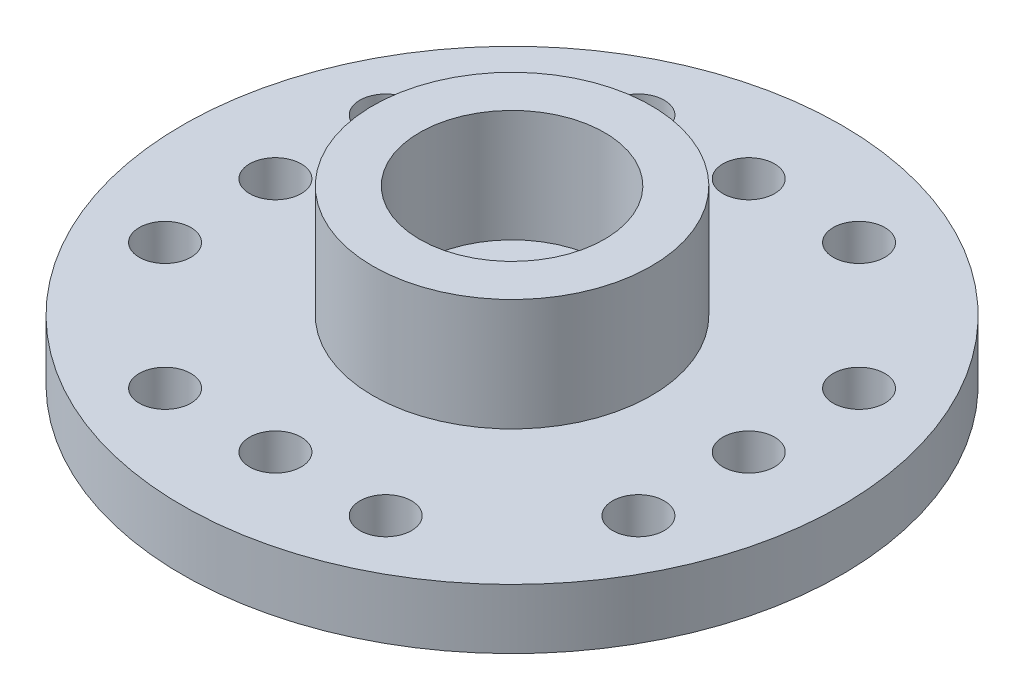
ISO-10303-21;
HEADER;
FILE_DESCRIPTION(('STEP AP214'),'2;1');
FILE_NAME('part.step','',(''),(''),'','','');
FILE_SCHEMA(('AUTOMOTIVE_DESIGN { 1 0 10303 214 1 1 1 1 }'));
ENDSEC;
DATA;
#1=APPLICATION_CONTEXT('core data for automotive mechanical design processes');
#2=APPLICATION_PROTOCOL_DEFINITION('international standard','automotive_design',2000,#1);
#3=PRODUCT_CONTEXT('',#1,'mechanical');
#4=PRODUCT('Part','Part','',(#3));
#5=PRODUCT_RELATED_PRODUCT_CATEGORY('part','',(#4));
#6=PRODUCT_DEFINITION_FORMATION('','',#4);
#7=PRODUCT_DEFINITION_CONTEXT('part definition',#1,'design');
#8=PRODUCT_DEFINITION('design','',#6,#7);
#9=PRODUCT_DEFINITION_SHAPE('','',#8);
#10=(LENGTH_UNIT() NAMED_UNIT(*) SI_UNIT(.MILLI.,.METRE.));
#11=(NAMED_UNIT(*) PLANE_ANGLE_UNIT() SI_UNIT($,.RADIAN.));
#12=(NAMED_UNIT(*) SI_UNIT($,.STERADIAN.) SOLID_ANGLE_UNIT());
#13=UNCERTAINTY_MEASURE_WITH_UNIT(LENGTH_MEASURE(1.E-05),#10,'distance_accuracy_value','');
#14=(GEOMETRIC_REPRESENTATION_CONTEXT(3) GLOBAL_UNCERTAINTY_ASSIGNED_CONTEXT((#13)) GLOBAL_UNIT_ASSIGNED_CONTEXT((#10,
#11,#12)) REPRESENTATION_CONTEXT('',''));
#15=CARTESIAN_POINT('',(0.,0.,0.));
#16=DIRECTION('',(0.,0.,1.));
#17=DIRECTION('',(1.,0.,0.));
#18=AXIS2_PLACEMENT_3D('',#15,#16,#17);
#19=CARTESIAN_POINT('',(0.,5.456,0.));
#20=DIRECTION('',(0.,-1.,0.));
#21=DIRECTION('',(0.,0.,-1.));
#22=AXIS2_PLACEMENT_3D('',#19,#20,#21);
#23=CYLINDRICAL_SURFACE('',#22,1.49225);
#24=CARTESIAN_POINT('',(0.,0.,0.));
#25=DIRECTION('',(0.,-1.,0.));
#26=DIRECTION('',(0.,0.,-1.));
#27=AXIS2_PLACEMENT_3D('',#24,#25,#26);
#28=CIRCLE('',#27,1.49225);
#29=CARTESIAN_POINT('',(0.,0.,-1.49225));
#30=VERTEX_POINT('',#29);
#31=EDGE_CURVE('E93',#30,#30,#28,.T.);
#32=ORIENTED_EDGE('',*,*,#31,.T.);
#33=EDGE_LOOP('',(#32));
#34=FACE_BOUND('',#33,.T.);
#35=CARTESIAN_POINT('',(0.,1.9,0.));
#36=DIRECTION('',(0.,1.,0.));
#37=DIRECTION('',(0.,0.,1.));
#38=AXIS2_PLACEMENT_3D('',#35,#36,#37);
#39=CIRCLE('',#38,1.49225);
#40=CARTESIAN_POINT('',(0.,1.9,1.49225));
#41=VERTEX_POINT('',#40);
#42=EDGE_CURVE('E35',#41,#41,#39,.F.);
#43=ORIENTED_EDGE('',*,*,#42,.F.);
#44=EDGE_LOOP('',(#43));
#45=FACE_BOUND('',#44,.T.);
#46=ADVANCED_FACE('F31',(#34,#45),#23,.F.);
#47=CARTESIAN_POINT('',(0.,1.9,0.));
#48=DIRECTION('',(0.,-1.,0.));
#49=DIRECTION('',(0.,0.,-1.));
#50=AXIS2_PLACEMENT_3D('',#47,#48,#49);
#51=CYLINDRICAL_SURFACE('',#50,10.4521);
#52=CARTESIAN_POINT('',(0.,1.9,0.));
#53=DIRECTION('',(0.,1.,0.));
#54=DIRECTION('',(0.,0.,1.));
#55=AXIS2_PLACEMENT_3D('',#52,#53,#54);
#56=CIRCLE('',#55,10.4521);
#57=CARTESIAN_POINT('',(0.,1.9,-10.4521));
#58=VERTEX_POINT('',#57);
#59=EDGE_CURVE('E39',#58,#58,#56,.T.);
#60=CARTESIAN_POINT('',(0.,0.,0.));
#61=DIRECTION('',(0.,1.,0.));
#62=DIRECTION('',(0.,0.,1.));
#63=AXIS2_PLACEMENT_3D('',#60,#61,#62);
#64=CIRCLE('',#63,10.4521);
#65=CARTESIAN_POINT('',(0.,0.,-10.4521));
#66=VERTEX_POINT('',#65);
#67=EDGE_CURVE('E44',#66,#66,#64,.T.);
#68=CARTESIAN_POINT('',(0.,1.9,-10.4521));
#69=CARTESIAN_POINT('',(0.,1.88020833333333,-10.4521));
#70=CARTESIAN_POINT('',(0.,1.86041666666667,-10.4521));
#71=CARTESIAN_POINT('',(0.,1.82083333333333,-10.4521));
#72=CARTESIAN_POINT('',(0.,1.80104166666667,-10.4521));
#73=CARTESIAN_POINT('',(0.,1.76145833333333,-10.4521));
#74=CARTESIAN_POINT('',(0.,1.74166666666667,-10.4521));
#75=CARTESIAN_POINT('',(0.,1.70208333333333,-10.4521));
#76=CARTESIAN_POINT('',(0.,1.68229166666667,-10.4521));
#77=CARTESIAN_POINT('',(0.,1.64270833333333,-10.4521));
#78=CARTESIAN_POINT('',(0.,1.62291666666667,-10.4521));
#79=CARTESIAN_POINT('',(0.,1.58333333333333,-10.4521));
#80=CARTESIAN_POINT('',(0.,1.56354166666667,-10.4521));
#81=CARTESIAN_POINT('',(0.,1.52395833333333,-10.4521));
#82=CARTESIAN_POINT('',(0.,1.50416666666667,-10.4521));
#83=CARTESIAN_POINT('',(0.,1.46458333333333,-10.4521));
#84=CARTESIAN_POINT('',(0.,1.44479166666667,-10.4521));
#85=CARTESIAN_POINT('',(0.,1.40520833333333,-10.4521));
#86=CARTESIAN_POINT('',(0.,1.38541666666667,-10.4521));
#87=CARTESIAN_POINT('',(0.,1.34583333333333,-10.4521));
#88=CARTESIAN_POINT('',(0.,1.32604166666667,-10.4521));
#89=CARTESIAN_POINT('',(0.,1.28645833333333,-10.4521));
#90=CARTESIAN_POINT('',(0.,1.26666666666667,-10.4521));
#91=CARTESIAN_POINT('',(0.,1.22708333333333,-10.4521));
#92=CARTESIAN_POINT('',(0.,1.20729166666667,-10.4521));
#93=CARTESIAN_POINT('',(0.,1.16770833333333,-10.4521));
#94=CARTESIAN_POINT('',(0.,1.14791666666667,-10.4521));
#95=CARTESIAN_POINT('',(0.,1.10833333333333,-10.4521));
#96=CARTESIAN_POINT('',(0.,1.08854166666667,-10.4521));
#97=CARTESIAN_POINT('',(0.,1.04895833333333,-10.4521));
#98=CARTESIAN_POINT('',(0.,1.02916666666667,-10.4521));
#99=CARTESIAN_POINT('',(0.,0.989583333333333,-10.4521));
#100=CARTESIAN_POINT('',(0.,0.969791666666666,-10.4521));
#101=CARTESIAN_POINT('',(0.,0.930208333333333,-10.4521));
#102=CARTESIAN_POINT('',(0.,0.910416666666667,-10.4521));
#103=CARTESIAN_POINT('',(0.,0.870833333333333,-10.4521));
#104=CARTESIAN_POINT('',(0.,0.851041666666667,-10.4521));
#105=CARTESIAN_POINT('',(0.,0.811458333333333,-10.4521));
#106=CARTESIAN_POINT('',(0.,0.791666666666667,-10.4521));
#107=CARTESIAN_POINT('',(0.,0.752083333333333,-10.4521));
#108=CARTESIAN_POINT('',(0.,0.732291666666667,-10.4521));
#109=CARTESIAN_POINT('',(0.,0.692708333333333,-10.4521));
#110=CARTESIAN_POINT('',(0.,0.672916666666667,-10.4521));
#111=CARTESIAN_POINT('',(0.,0.633333333333333,-10.4521));
#112=CARTESIAN_POINT('',(0.,0.613541666666667,-10.4521));
#113=CARTESIAN_POINT('',(0.,0.573958333333333,-10.4521));
#114=CARTESIAN_POINT('',(0.,0.554166666666667,-10.4521));
#115=CARTESIAN_POINT('',(0.,0.514583333333334,-10.4521));
#116=CARTESIAN_POINT('',(0.,0.494791666666667,-10.4521));
#117=CARTESIAN_POINT('',(0.,0.455208333333333,-10.4521));
#118=CARTESIAN_POINT('',(0.,0.435416666666667,-10.4521));
#119=CARTESIAN_POINT('',(0.,0.395833333333333,-10.4521));
#120=CARTESIAN_POINT('',(0.,0.376041666666667,-10.4521));
#121=CARTESIAN_POINT('',(0.,0.336458333333333,-10.4521));
#122=CARTESIAN_POINT('',(0.,0.316666666666667,-10.4521));
#123=CARTESIAN_POINT('',(0.,0.277083333333333,-10.4521));
#124=CARTESIAN_POINT('',(0.,0.257291666666667,-10.4521));
#125=CARTESIAN_POINT('',(0.,0.217708333333333,-10.4521));
#126=CARTESIAN_POINT('',(0.,0.197916666666667,-10.4521));
#127=CARTESIAN_POINT('',(0.,0.158333333333333,-10.4521));
#128=CARTESIAN_POINT('',(0.,0.138541666666667,-10.4521));
#129=CARTESIAN_POINT('',(0.,0.0989583333333333,-10.4521));
#130=CARTESIAN_POINT('',(0.,0.0791666666666666,-10.4521));
#131=CARTESIAN_POINT('',(0.,0.0395833333333333,-10.4521));
#132=CARTESIAN_POINT('',(0.,0.0197916666666666,-10.4521));
#133=CARTESIAN_POINT('',(0.,0.,-10.4521));
#134=B_SPLINE_CURVE_WITH_KNOTS('',3,(#68,#69,#70,#71,#72,#73,#74,#75,#76,#77,#78,#79,#80,#81,
#82,#83,#84,#85,#86,#87,#88,#89,#90,#91,#92,#93,#94,#95,#96,#97,#98,#99,#100,#101,#102,#103,
#104,#105,#106,#107,#108,#109,#110,#111,#112,#113,#114,#115,#116,#117,#118,#119,#120,#121,#122,
#123,#124,#125,#126,#127,#128,#129,#130,#131,#132,#133),.UNSPECIFIED.,.F.,.F.,(4,2,2,2,2,2,2,2,
2,2,2,2,2,2,2,2,2,2,2,2,2,2,2,2,2,2,2,2,2,2,2,2,4),(0.,0.0593750000000002,0.11875,0.178125,
0.2375,0.296875,0.35625,0.415625,0.475,0.534375,0.59375,0.653125,0.7125,0.771875,0.83125,
0.890625,0.95,1.009375,1.06875,1.128125,1.1875,1.246875,1.30625,1.365625,1.425,1.484375,1.54375,
1.603125,1.6625,1.721875,1.78125,1.840625,1.9),.UNSPECIFIED.);
#135=EDGE_CURVE('BSEAM33',#58,#66,#134,.T.);
#136=ORIENTED_EDGE('',*,*,#59,.F.);
#137=ORIENTED_EDGE('',*,*,#67,.T.);
#138=ORIENTED_EDGE('',*,*,#135,.T.);
#139=ORIENTED_EDGE('',*,*,#135,.F.);
#140=EDGE_LOOP('',(#136,#138,#137,#139));
#141=FACE_BOUND('',#140,.T.);
#142=ADVANCED_FACE('F33',(#141),#51,.T.);
#143=CARTESIAN_POINT('',(0.,1.9,0.));
#144=DIRECTION('',(0.,1.,0.));
#145=DIRECTION('',(0.,0.,1.));
#146=AXIS2_PLACEMENT_3D('',#143,#144,#145);
#147=PLANE('',#146);
#148=CARTESIAN_POINT('',(7.50569999999998,1.9,-3.49885000000005));
#149=DIRECTION('',(0.,1.,0.));
#150=DIRECTION('',(0.,0.,1.));
#151=AXIS2_PLACEMENT_3D('',#148,#149,#150);
#152=CIRCLE('',#151,0.819150000000002);
#153=CARTESIAN_POINT('',(7.50569999999998,1.9,-2.67970000000005));
#154=VERTEX_POINT('',#153);
#155=EDGE_CURVE('E53',#154,#154,#152,.T.);
#156=ORIENTED_EDGE('',*,*,#155,.F.);
#157=EDGE_LOOP('',(#156));
#158=FACE_BOUND('',#157,.T.);
#159=CARTESIAN_POINT('',(7.5057,1.9,0.));
#160=DIRECTION('',(0.,1.,0.));
#161=DIRECTION('',(0.,0.,1.));
#162=AXIS2_PLACEMENT_3D('',#159,#160,#161);
#163=CIRCLE('',#162,0.819150000000001);
#164=CARTESIAN_POINT('',(7.5057,1.9,0.819149999999949));
#165=VERTEX_POINT('',#164);
#166=EDGE_CURVE('E57',#165,#165,#163,.T.);
#167=ORIENTED_EDGE('',*,*,#166,.F.);
#168=EDGE_LOOP('',(#167));
#169=FACE_BOUND('',#168,.T.);
#170=CARTESIAN_POINT('',(-3.49884999999997,1.9,7.50570000000001));
#171=DIRECTION('',(0.,1.,0.));
#172=DIRECTION('',(0.,0.,1.));
#173=AXIS2_PLACEMENT_3D('',#170,#171,#172);
#174=CIRCLE('',#173,0.819150000000001);
#175=CARTESIAN_POINT('',(-3.49884999999997,1.9,8.32485000000001));
#176=VERTEX_POINT('',#175);
#177=EDGE_CURVE('E61',#176,#176,#174,.T.);
#178=ORIENTED_EDGE('',*,*,#177,.F.);
#179=EDGE_LOOP('',(#178));
#180=FACE_BOUND('',#179,.T.);
#181=CARTESIAN_POINT('',(3.49885000000002,1.9,7.50569999999999));
#182=DIRECTION('',(0.,1.,0.));
#183=DIRECTION('',(0.,0.,1.));
#184=AXIS2_PLACEMENT_3D('',#181,#182,#183);
#185=CIRCLE('',#184,0.819150000000002);
#186=CARTESIAN_POINT('',(3.49885000000002,1.9,8.32484999999999));
#187=VERTEX_POINT('',#186);
#188=EDGE_CURVE('E66',#187,#187,#185,.T.);
#189=ORIENTED_EDGE('',*,*,#188,.F.);
#190=EDGE_LOOP('',(#189));
#191=FACE_BOUND('',#190,.T.);
#192=CARTESIAN_POINT('',(-7.5057,1.9,0.));
#193=DIRECTION('',(0.,1.,0.));
#194=DIRECTION('',(0.,0.,1.));
#195=AXIS2_PLACEMENT_3D('',#192,#193,#194);
#196=CIRCLE('',#195,0.819150000000001);
#197=CARTESIAN_POINT('',(-7.5057,1.9,0.81915));
#198=VERTEX_POINT('',#197);
#199=EDGE_CURVE('E69',#198,#198,#196,.T.);
#200=ORIENTED_EDGE('',*,*,#199,.F.);
#201=EDGE_LOOP('',(#200));
#202=FACE_BOUND('',#201,.T.);
#203=CARTESIAN_POINT('',(-7.5057,1.9,3.49885));
#204=DIRECTION('',(0.,1.,0.));
#205=DIRECTION('',(0.,0.,1.));
#206=AXIS2_PLACEMENT_3D('',#203,#204,#205);
#207=CIRCLE('',#206,0.819150000000002);
#208=CARTESIAN_POINT('',(-7.5057,1.9,4.318));
#209=VERTEX_POINT('',#208);
#210=EDGE_CURVE('E72',#209,#209,#207,.T.);
#211=ORIENTED_EDGE('',*,*,#210,.F.);
#212=EDGE_LOOP('',(#211));
#213=FACE_BOUND('',#212,.T.);
#214=CARTESIAN_POINT('',(-7.5057,1.9,-3.49885));
#215=DIRECTION('',(0.,1.,0.));
#216=DIRECTION('',(0.,0.,1.));
#217=AXIS2_PLACEMENT_3D('',#214,#215,#216);
#218=CIRCLE('',#217,0.819150000000001);
#219=CARTESIAN_POINT('',(-7.5057,1.9,-2.6797));
#220=VERTEX_POINT('',#219);
#221=EDGE_CURVE('E75',#220,#220,#218,.T.);
#222=ORIENTED_EDGE('',*,*,#221,.F.);
#223=EDGE_LOOP('',(#222));
#224=FACE_BOUND('',#223,.T.);
#225=CARTESIAN_POINT('',(0.,1.9,7.5057));
#226=DIRECTION('',(0.,1.,0.));
#227=DIRECTION('',(0.,0.,1.));
#228=AXIS2_PLACEMENT_3D('',#225,#226,#227);
#229=CIRCLE('',#228,0.819150000000001);
#230=CARTESIAN_POINT('',(0.,1.9,8.32485));
#231=VERTEX_POINT('',#230);
#232=EDGE_CURVE('E78',#231,#231,#229,.T.);
#233=ORIENTED_EDGE('',*,*,#232,.F.);
#234=EDGE_LOOP('',(#233));
#235=FACE_BOUND('',#234,.T.);
#236=CARTESIAN_POINT('',(3.49884999999992,1.9,-7.50570000000004));
#237=DIRECTION('',(0.,1.,0.));
#238=DIRECTION('',(0.,0.,1.));
#239=AXIS2_PLACEMENT_3D('',#236,#237,#238);
#240=CIRCLE('',#239,0.819150000000001);
#241=CARTESIAN_POINT('',(3.49884999999992,1.9,-6.68655000000004));
#242=VERTEX_POINT('',#241);
#243=EDGE_CURVE('E81',#242,#242,#240,.T.);
#244=ORIENTED_EDGE('',*,*,#243,.F.);
#245=EDGE_LOOP('',(#244));
#246=FACE_BOUND('',#245,.T.);
#247=CARTESIAN_POINT('',(-3.49885000000008,1.9,-7.50569999999996));
#248=DIRECTION('',(0.,1.,0.));
#249=DIRECTION('',(0.,0.,1.));
#250=AXIS2_PLACEMENT_3D('',#247,#248,#249);
#251=CIRCLE('',#250,0.819150000000002);
#252=CARTESIAN_POINT('',(-3.49885000000008,1.9,-6.68654999999996));
#253=VERTEX_POINT('',#252);
#254=EDGE_CURVE('E84',#253,#253,#251,.T.);
#255=ORIENTED_EDGE('',*,*,#254,.F.);
#256=EDGE_LOOP('',(#255));
#257=FACE_BOUND('',#256,.T.);
#258=CARTESIAN_POINT('',(0.,1.9,-7.5057));
#259=DIRECTION('',(0.,1.,0.));
#260=DIRECTION('',(0.,0.,1.));
#261=AXIS2_PLACEMENT_3D('',#258,#259,#260);
#262=CIRCLE('',#261,0.819150000000001);
#263=CARTESIAN_POINT('',(0.,1.9,-6.68655));
#264=VERTEX_POINT('',#263);
#265=EDGE_CURVE('E87',#264,#264,#262,.T.);
#266=ORIENTED_EDGE('',*,*,#265,.F.);
#267=EDGE_LOOP('',(#266));
#268=FACE_BOUND('',#267,.T.);
#269=CARTESIAN_POINT('',(7.50570000000002,1.9,3.49884999999995));
#270=DIRECTION('',(0.,1.,0.));
#271=DIRECTION('',(0.,0.,1.));
#272=AXIS2_PLACEMENT_3D('',#269,#270,#271);
#273=CIRCLE('',#272,0.819150000000001);
#274=CARTESIAN_POINT('',(7.50570000000002,1.9,4.31799999999995));
#275=VERTEX_POINT('',#274);
#276=EDGE_CURVE('E90',#275,#275,#273,.T.);
#277=ORIENTED_EDGE('',*,*,#276,.F.);
#278=EDGE_LOOP('',(#277));
#279=FACE_BOUND('',#278,.T.);
#280=CARTESIAN_POINT('',(0.,1.9,0.));
#281=DIRECTION('',(0.,1.,0.));
#282=DIRECTION('',(0.,0.,1.));
#283=AXIS2_PLACEMENT_3D('',#280,#281,#282);
#284=CIRCLE('',#283,4.41325);
#285=CARTESIAN_POINT('',(0.,1.9,4.41325));
#286=VERTEX_POINT('',#285);
#287=EDGE_CURVE('E10',#286,#286,#284,.T.);
#288=ORIENTED_EDGE('',*,*,#287,.F.);
#289=EDGE_LOOP('',(#288));
#290=FACE_BOUND('',#289,.T.);
#291=ORIENTED_EDGE('',*,*,#59,.T.);
#292=EDGE_LOOP('',(#291));
#293=FACE_BOUND('',#292,.T.);
#294=ADVANCED_FACE('F162',(#158,#169,#180,#191,#202,#213,#224,#235,#246,#257,#268,#279,#290,
#293),#147,.T.);
#295=CARTESIAN_POINT('',(0.,0.,0.));
#296=DIRECTION('',(0.,1.,0.));
#297=DIRECTION('',(0.,0.,1.));
#298=AXIS2_PLACEMENT_3D('',#295,#296,#297);
#299=PLANE('',#298);
#300=CARTESIAN_POINT('',(7.50569999999998,0.,-3.49885000000005));
#301=DIRECTION('',(0.,-1.,0.));
#302=DIRECTION('',(0.,0.,-1.));
#303=AXIS2_PLACEMENT_3D('',#300,#301,#302);
#304=CIRCLE('',#303,0.819150000000002);
#305=CARTESIAN_POINT('',(7.50569999999998,0.,-4.31800000000005));
#306=VERTEX_POINT('',#305);
#307=EDGE_CURVE('E109',#306,#306,#304,.T.);
#308=ORIENTED_EDGE('',*,*,#307,.F.);
#309=EDGE_LOOP('',(#308));
#310=FACE_BOUND('',#309,.T.);
#311=CARTESIAN_POINT('',(7.5057,0.,0.));
#312=DIRECTION('',(0.,-1.,0.));
#313=DIRECTION('',(0.,0.,-1.));
#314=AXIS2_PLACEMENT_3D('',#311,#312,#313);
#315=CIRCLE('',#314,0.819150000000001);
#316=CARTESIAN_POINT('',(7.5057,0.,-0.819150000000052));
#317=VERTEX_POINT('',#316);
#318=EDGE_CURVE('E112',#317,#317,#315,.T.);
#319=ORIENTED_EDGE('',*,*,#318,.F.);
#320=EDGE_LOOP('',(#319));
#321=FACE_BOUND('',#320,.T.);
#322=CARTESIAN_POINT('',(-3.49884999999997,0.,7.50570000000001));
#323=DIRECTION('',(0.,-1.,0.));
#324=DIRECTION('',(0.,0.,-1.));
#325=AXIS2_PLACEMENT_3D('',#322,#323,#324);
#326=CIRCLE('',#325,0.819150000000001);
#327=CARTESIAN_POINT('',(-3.49884999999997,0.,6.68655000000001));
#328=VERTEX_POINT('',#327);
#329=EDGE_CURVE('E116',#328,#328,#326,.T.);
#330=ORIENTED_EDGE('',*,*,#329,.F.);
#331=EDGE_LOOP('',(#330));
#332=FACE_BOUND('',#331,.T.);
#333=CARTESIAN_POINT('',(3.49885000000002,0.,7.50569999999999));
#334=DIRECTION('',(0.,-1.,0.));
#335=DIRECTION('',(0.,0.,-1.));
#336=AXIS2_PLACEMENT_3D('',#333,#334,#335);
#337=CIRCLE('',#336,0.819150000000002);
#338=CARTESIAN_POINT('',(3.49885000000002,0.,6.68654999999999));
#339=VERTEX_POINT('',#338);
#340=EDGE_CURVE('E106',#339,#339,#337,.T.);
#341=ORIENTED_EDGE('',*,*,#340,.F.);
#342=EDGE_LOOP('',(#341));
#343=FACE_BOUND('',#342,.T.);
#344=CARTESIAN_POINT('',(-7.5057,0.,0.));
#345=DIRECTION('',(0.,-1.,0.));
#346=DIRECTION('',(0.,0.,-1.));
#347=AXIS2_PLACEMENT_3D('',#344,#345,#346);
#348=CIRCLE('',#347,0.819150000000001);
#349=CARTESIAN_POINT('',(-7.5057,0.,-0.819150000000001));
#350=VERTEX_POINT('',#349);
#351=EDGE_CURVE('E96',#350,#350,#348,.T.);
#352=ORIENTED_EDGE('',*,*,#351,.F.);
#353=EDGE_LOOP('',(#352));
#354=FACE_BOUND('',#353,.T.);
#355=CARTESIAN_POINT('',(-7.5057,0.,3.49885));
#356=DIRECTION('',(0.,-1.,0.));
#357=DIRECTION('',(0.,0.,-1.));
#358=AXIS2_PLACEMENT_3D('',#355,#356,#357);
#359=CIRCLE('',#358,0.819150000000002);
#360=CARTESIAN_POINT('',(-7.5057,0.,2.6797));
#361=VERTEX_POINT('',#360);
#362=EDGE_CURVE('E97',#361,#361,#359,.T.);
#363=ORIENTED_EDGE('',*,*,#362,.F.);
#364=EDGE_LOOP('',(#363));
#365=FACE_BOUND('',#364,.T.);
#366=CARTESIAN_POINT('',(-7.5057,0.,-3.49885));
#367=DIRECTION('',(0.,-1.,0.));
#368=DIRECTION('',(0.,0.,-1.));
#369=AXIS2_PLACEMENT_3D('',#366,#367,#368);
#370=CIRCLE('',#369,0.819150000000001);
#371=CARTESIAN_POINT('',(-7.5057,0.,-4.318));
#372=VERTEX_POINT('',#371);
#373=EDGE_CURVE('E100',#372,#372,#370,.T.);
#374=ORIENTED_EDGE('',*,*,#373,.F.);
#375=EDGE_LOOP('',(#374));
#376=FACE_BOUND('',#375,.T.);
#377=CARTESIAN_POINT('',(0.,0.,7.5057));
#378=DIRECTION('',(0.,-1.,0.));
#379=DIRECTION('',(0.,0.,-1.));
#380=AXIS2_PLACEMENT_3D('',#377,#378,#379);
#381=CIRCLE('',#380,0.819150000000001);
#382=CARTESIAN_POINT('',(0.,0.,6.68655));
#383=VERTEX_POINT('',#382);
#384=EDGE_CURVE('E103',#383,#383,#381,.T.);
#385=ORIENTED_EDGE('',*,*,#384,.F.);
#386=EDGE_LOOP('',(#385));
#387=FACE_BOUND('',#386,.T.);
#388=CARTESIAN_POINT('',(3.49884999999992,0.,-7.50570000000004));
#389=DIRECTION('',(0.,-1.,0.));
#390=DIRECTION('',(0.,0.,-1.));
#391=AXIS2_PLACEMENT_3D('',#388,#389,#390);
#392=CIRCLE('',#391,0.819150000000001);
#393=CARTESIAN_POINT('',(3.49884999999992,0.,-8.32485000000004));
#394=VERTEX_POINT('',#393);
#395=EDGE_CURVE('E127',#394,#394,#392,.T.);
#396=ORIENTED_EDGE('',*,*,#395,.F.);
#397=EDGE_LOOP('',(#396));
#398=FACE_BOUND('',#397,.T.);
#399=CARTESIAN_POINT('',(-3.49885000000008,0.,-7.50569999999996));
#400=DIRECTION('',(0.,-1.,0.));
#401=DIRECTION('',(0.,0.,-1.));
#402=AXIS2_PLACEMENT_3D('',#399,#400,#401);
#403=CIRCLE('',#402,0.819150000000002);
#404=CARTESIAN_POINT('',(-3.49885000000008,0.,-8.32484999999997));
#405=VERTEX_POINT('',#404);
#406=EDGE_CURVE('E124',#405,#405,#403,.T.);
#407=ORIENTED_EDGE('',*,*,#406,.F.);
#408=EDGE_LOOP('',(#407));
#409=FACE_BOUND('',#408,.T.);
#410=CARTESIAN_POINT('',(0.,0.,-7.5057));
#411=DIRECTION('',(0.,-1.,0.));
#412=DIRECTION('',(0.,0.,-1.));
#413=AXIS2_PLACEMENT_3D('',#410,#411,#412);
#414=CIRCLE('',#413,0.819150000000001);
#415=CARTESIAN_POINT('',(0.,0.,-8.32485));
#416=VERTEX_POINT('',#415);
#417=EDGE_CURVE('E121',#416,#416,#414,.T.);
#418=ORIENTED_EDGE('',*,*,#417,.F.);
#419=EDGE_LOOP('',(#418));
#420=FACE_BOUND('',#419,.T.);
#421=CARTESIAN_POINT('',(7.50570000000002,0.,3.49884999999995));
#422=DIRECTION('',(0.,-1.,0.));
#423=DIRECTION('',(0.,0.,-1.));
#424=AXIS2_PLACEMENT_3D('',#421,#422,#423);
#425=CIRCLE('',#424,0.819150000000001);
#426=CARTESIAN_POINT('',(7.50570000000002,0.,2.67969999999995));
#427=VERTEX_POINT('',#426);
#428=EDGE_CURVE('E113',#427,#427,#425,.T.);
#429=ORIENTED_EDGE('',*,*,#428,.F.);
#430=EDGE_LOOP('',(#429));
#431=FACE_BOUND('',#430,.T.);
#432=ORIENTED_EDGE('',*,*,#31,.F.);
#433=EDGE_LOOP('',(#432));
#434=FACE_BOUND('',#433,.T.);
#435=ORIENTED_EDGE('',*,*,#67,.F.);
#436=EDGE_LOOP('',(#435));
#437=FACE_BOUND('',#436,.T.);
#438=ADVANCED_FACE('F153',(#310,#321,#332,#343,#354,#365,#376,#387,#398,#409,#420,#431,#434,
#437),#299,.F.);
#439=CARTESIAN_POINT('',(0.,5.456,0.));
#440=DIRECTION('',(0.,-1.,0.));
#441=DIRECTION('',(0.,0.,-1.));
#442=AXIS2_PLACEMENT_3D('',#439,#440,#441);
#443=CYLINDRICAL_SURFACE('',#442,4.41325);
#444=CARTESIAN_POINT('',(0.,5.456,0.));
#445=DIRECTION('',(0.,1.,0.));
#446=DIRECTION('',(0.,0.,1.));
#447=AXIS2_PLACEMENT_3D('',#444,#445,#446);
#448=CIRCLE('',#447,4.41325);
#449=CARTESIAN_POINT('',(0.,5.456,4.41325));
#450=VERTEX_POINT('',#449);
#451=EDGE_CURVE('E47',#450,#450,#448,.T.);
#452=ORIENTED_EDGE('',*,*,#451,.F.);
#453=EDGE_LOOP('',(#452));
#454=FACE_BOUND('',#453,.T.);
#455=ORIENTED_EDGE('',*,*,#287,.T.);
#456=EDGE_LOOP('',(#455));
#457=FACE_BOUND('',#456,.T.);
#458=ADVANCED_FACE('F144',(#454,#457),#443,.T.);
#459=CARTESIAN_POINT('',(0.,5.456,0.));
#460=DIRECTION('',(0.,1.,0.));
#461=DIRECTION('',(0.,0.,1.));
#462=AXIS2_PLACEMENT_3D('',#459,#460,#461);
#463=PLANE('',#462);
#464=CARTESIAN_POINT('',(0.,5.456,0.));
#465=DIRECTION('',(0.,1.,0.));
#466=DIRECTION('',(0.,0.,1.));
#467=AXIS2_PLACEMENT_3D('',#464,#465,#466);
#468=CIRCLE('',#467,2.9337);
#469=CARTESIAN_POINT('',(0.,5.456,2.9337));
#470=VERTEX_POINT('',#469);
#471=EDGE_CURVE('E135',#470,#470,#468,.T.);
#472=ORIENTED_EDGE('',*,*,#471,.F.);
#473=EDGE_LOOP('',(#472));
#474=FACE_BOUND('',#473,.T.);
#475=ORIENTED_EDGE('',*,*,#451,.T.);
#476=EDGE_LOOP('',(#475));
#477=FACE_BOUND('',#476,.T.);
#478=ADVANCED_FACE('F141',(#474,#477),#463,.T.);
#479=CARTESIAN_POINT('',(7.50570000000002,5.456,3.49884999999995));
#480=DIRECTION('',(0.,-1.,0.));
#481=DIRECTION('',(0.,0.,-1.));
#482=AXIS2_PLACEMENT_3D('',#479,#480,#481);
#483=CYLINDRICAL_SURFACE('',#482,0.819150000000001);
#484=ORIENTED_EDGE('',*,*,#276,.T.);
#485=EDGE_LOOP('',(#484));
#486=FACE_BOUND('',#485,.T.);
#487=ORIENTED_EDGE('',*,*,#428,.T.);
#488=EDGE_LOOP('',(#487));
#489=FACE_BOUND('',#488,.T.);
#490=ADVANCED_FACE('F143',(#486,#489),#483,.F.);
#491=CARTESIAN_POINT('',(0.,5.456,-7.5057));
#492=DIRECTION('',(0.,-1.,0.));
#493=DIRECTION('',(0.,0.,-1.));
#494=AXIS2_PLACEMENT_3D('',#491,#492,#493);
#495=CYLINDRICAL_SURFACE('',#494,0.819150000000001);
#496=ORIENTED_EDGE('',*,*,#265,.T.);
#497=EDGE_LOOP('',(#496));
#498=FACE_BOUND('',#497,.T.);
#499=ORIENTED_EDGE('',*,*,#417,.T.);
#500=EDGE_LOOP('',(#499));
#501=FACE_BOUND('',#500,.T.);
#502=ADVANCED_FACE('F150',(#498,#501),#495,.F.);
#503=CARTESIAN_POINT('',(-3.49885000000008,5.456,-7.50569999999996));
#504=DIRECTION('',(0.,-1.,0.));
#505=DIRECTION('',(0.,0.,-1.));
#506=AXIS2_PLACEMENT_3D('',#503,#504,#505);
#507=CYLINDRICAL_SURFACE('',#506,0.819150000000002);
#508=ORIENTED_EDGE('',*,*,#254,.T.);
#509=EDGE_LOOP('',(#508));
#510=FACE_BOUND('',#509,.T.);
#511=ORIENTED_EDGE('',*,*,#406,.T.);
#512=EDGE_LOOP('',(#511));
#513=FACE_BOUND('',#512,.T.);
#514=ADVANCED_FACE('F200',(#510,#513),#507,.F.);
#515=CARTESIAN_POINT('',(3.49884999999992,5.456,-7.50570000000004));
#516=DIRECTION('',(0.,-1.,0.));
#517=DIRECTION('',(0.,0.,-1.));
#518=AXIS2_PLACEMENT_3D('',#515,#516,#517);
#519=CYLINDRICAL_SURFACE('',#518,0.819150000000001);
#520=ORIENTED_EDGE('',*,*,#243,.T.);
#521=EDGE_LOOP('',(#520));
#522=FACE_BOUND('',#521,.T.);
#523=ORIENTED_EDGE('',*,*,#395,.T.);
#524=EDGE_LOOP('',(#523));
#525=FACE_BOUND('',#524,.T.);
#526=ADVANCED_FACE('F179',(#522,#525),#519,.F.);
#527=CARTESIAN_POINT('',(0.,5.456,7.5057));
#528=DIRECTION('',(0.,-1.,0.));
#529=DIRECTION('',(0.,0.,-1.));
#530=AXIS2_PLACEMENT_3D('',#527,#528,#529);
#531=CYLINDRICAL_SURFACE('',#530,0.819150000000001);
#532=ORIENTED_EDGE('',*,*,#232,.T.);
#533=EDGE_LOOP('',(#532));
#534=FACE_BOUND('',#533,.T.);
#535=ORIENTED_EDGE('',*,*,#384,.T.);
#536=EDGE_LOOP('',(#535));
#537=FACE_BOUND('',#536,.T.);
#538=ADVANCED_FACE('F176',(#534,#537),#531,.F.);
#539=CARTESIAN_POINT('',(-7.5057,5.456,-3.49885));
#540=DIRECTION('',(0.,-1.,0.));
#541=DIRECTION('',(0.,0.,-1.));
#542=AXIS2_PLACEMENT_3D('',#539,#540,#541);
#543=CYLINDRICAL_SURFACE('',#542,0.819150000000001);
#544=ORIENTED_EDGE('',*,*,#221,.T.);
#545=EDGE_LOOP('',(#544));
#546=FACE_BOUND('',#545,.T.);
#547=ORIENTED_EDGE('',*,*,#373,.T.);
#548=EDGE_LOOP('',(#547));
#549=FACE_BOUND('',#548,.T.);
#550=ADVANCED_FACE('F170',(#546,#549),#543,.F.);
#551=CARTESIAN_POINT('',(-7.5057,5.456,3.49885));
#552=DIRECTION('',(0.,-1.,0.));
#553=DIRECTION('',(0.,0.,-1.));
#554=AXIS2_PLACEMENT_3D('',#551,#552,#553);
#555=CYLINDRICAL_SURFACE('',#554,0.819150000000002);
#556=ORIENTED_EDGE('',*,*,#210,.T.);
#557=EDGE_LOOP('',(#556));
#558=FACE_BOUND('',#557,.T.);
#559=ORIENTED_EDGE('',*,*,#362,.T.);
#560=EDGE_LOOP('',(#559));
#561=FACE_BOUND('',#560,.T.);
#562=ADVANCED_FACE('F166',(#558,#561),#555,.F.);
#563=CARTESIAN_POINT('',(-7.5057,5.456,0.));
#564=DIRECTION('',(0.,-1.,0.));
#565=DIRECTION('',(0.,0.,-1.));
#566=AXIS2_PLACEMENT_3D('',#563,#564,#565);
#567=CYLINDRICAL_SURFACE('',#566,0.819150000000001);
#568=ORIENTED_EDGE('',*,*,#199,.T.);
#569=EDGE_LOOP('',(#568));
#570=FACE_BOUND('',#569,.T.);
#571=ORIENTED_EDGE('',*,*,#351,.T.);
#572=EDGE_LOOP('',(#571));
#573=FACE_BOUND('',#572,.T.);
#574=ADVANCED_FACE('F169',(#570,#573),#567,.F.);
#575=CARTESIAN_POINT('',(3.49885000000002,5.456,7.50569999999999));
#576=DIRECTION('',(0.,-1.,0.));
#577=DIRECTION('',(0.,0.,-1.));
#578=AXIS2_PLACEMENT_3D('',#575,#576,#577);
#579=CYLINDRICAL_SURFACE('',#578,0.819150000000002);
#580=ORIENTED_EDGE('',*,*,#188,.T.);
#581=EDGE_LOOP('',(#580));
#582=FACE_BOUND('',#581,.T.);
#583=ORIENTED_EDGE('',*,*,#340,.T.);
#584=EDGE_LOOP('',(#583));
#585=FACE_BOUND('',#584,.T.);
#586=ADVANCED_FACE('F174',(#582,#585),#579,.F.);
#587=CARTESIAN_POINT('',(-3.49884999999997,5.456,7.50570000000001));
#588=DIRECTION('',(0.,-1.,0.));
#589=DIRECTION('',(0.,0.,-1.));
#590=AXIS2_PLACEMENT_3D('',#587,#588,#589);
#591=CYLINDRICAL_SURFACE('',#590,0.819150000000001);
#592=ORIENTED_EDGE('',*,*,#177,.T.);
#593=EDGE_LOOP('',(#592));
#594=FACE_BOUND('',#593,.T.);
#595=ORIENTED_EDGE('',*,*,#329,.T.);
#596=EDGE_LOOP('',(#595));
#597=FACE_BOUND('',#596,.T.);
#598=ADVANCED_FACE('F191',(#594,#597),#591,.F.);
#599=CARTESIAN_POINT('',(7.5057,5.456,0.));
#600=DIRECTION('',(0.,-1.,0.));
#601=DIRECTION('',(0.,0.,-1.));
#602=AXIS2_PLACEMENT_3D('',#599,#600,#601);
#603=CYLINDRICAL_SURFACE('',#602,0.819150000000001);
#604=ORIENTED_EDGE('',*,*,#166,.T.);
#605=EDGE_LOOP('',(#604));
#606=FACE_BOUND('',#605,.T.);
#607=ORIENTED_EDGE('',*,*,#318,.T.);
#608=EDGE_LOOP('',(#607));
#609=FACE_BOUND('',#608,.T.);
#610=ADVANCED_FACE('F188',(#606,#609),#603,.F.);
#611=CARTESIAN_POINT('',(7.50569999999998,5.456,-3.49885000000005));
#612=DIRECTION('',(0.,-1.,0.));
#613=DIRECTION('',(0.,0.,-1.));
#614=AXIS2_PLACEMENT_3D('',#611,#612,#613);
#615=CYLINDRICAL_SURFACE('',#614,0.819150000000002);
#616=ORIENTED_EDGE('',*,*,#155,.T.);
#617=EDGE_LOOP('',(#616));
#618=FACE_BOUND('',#617,.T.);
#619=ORIENTED_EDGE('',*,*,#307,.T.);
#620=EDGE_LOOP('',(#619));
#621=FACE_BOUND('',#620,.T.);
#622=ADVANCED_FACE('F184',(#618,#621),#615,.F.);
#623=CARTESIAN_POINT('',(0.,1.9,0.));
#624=DIRECTION('',(0.,1.,0.));
#625=DIRECTION('',(0.,0.,1.));
#626=AXIS2_PLACEMENT_3D('',#623,#624,#625);
#627=PLANE('',#626);
#628=CARTESIAN_POINT('',(0.,1.9,0.));
#629=DIRECTION('',(0.,1.,0.));
#630=DIRECTION('',(0.,0.,1.));
#631=AXIS2_PLACEMENT_3D('',#628,#629,#630);
#632=CIRCLE('',#631,2.9337);
#633=CARTESIAN_POINT('',(0.,1.9,2.9337));
#634=VERTEX_POINT('',#633);
#635=EDGE_CURVE('E132',#634,#634,#632,.F.);
#636=ORIENTED_EDGE('',*,*,#635,.F.);
#637=EDGE_LOOP('',(#636));
#638=FACE_BOUND('',#637,.T.);
#639=ORIENTED_EDGE('',*,*,#42,.T.);
#640=EDGE_LOOP('',(#639));
#641=FACE_BOUND('',#640,.T.);
#642=ADVANCED_FACE('F187',(#638,#641),#627,.T.);
#643=CARTESIAN_POINT('',(0.,-6.3977566558679,0.));
#644=DIRECTION('',(0.,1.,0.));
#645=DIRECTION('',(0.,0.,1.));
#646=AXIS2_PLACEMENT_3D('',#643,#644,#645);
#647=CYLINDRICAL_SURFACE('',#646,2.9337);
#648=ORIENTED_EDGE('',*,*,#635,.T.);
#649=EDGE_LOOP('',(#648));
#650=FACE_BOUND('',#649,.T.);
#651=ORIENTED_EDGE('',*,*,#471,.T.);
#652=EDGE_LOOP('',(#651));
#653=FACE_BOUND('',#652,.T.);
#654=ADVANCED_FACE('F139',(#650,#653),#647,.F.);
#655=CLOSED_SHELL('',(#46,#142,#294,#438,#458,#478,#490,#502,#514,#526,#538,#550,#562,#574,#586,
#598,#610,#622,#642,#654));
#656=MANIFOLD_SOLID_BREP('B2',#655);
#657=ADVANCED_BREP_SHAPE_REPRESENTATION('',(#18,#656),#14);
#658=SHAPE_DEFINITION_REPRESENTATION(#9,#657);
ENDSEC;
END-ISO-10303-21;
